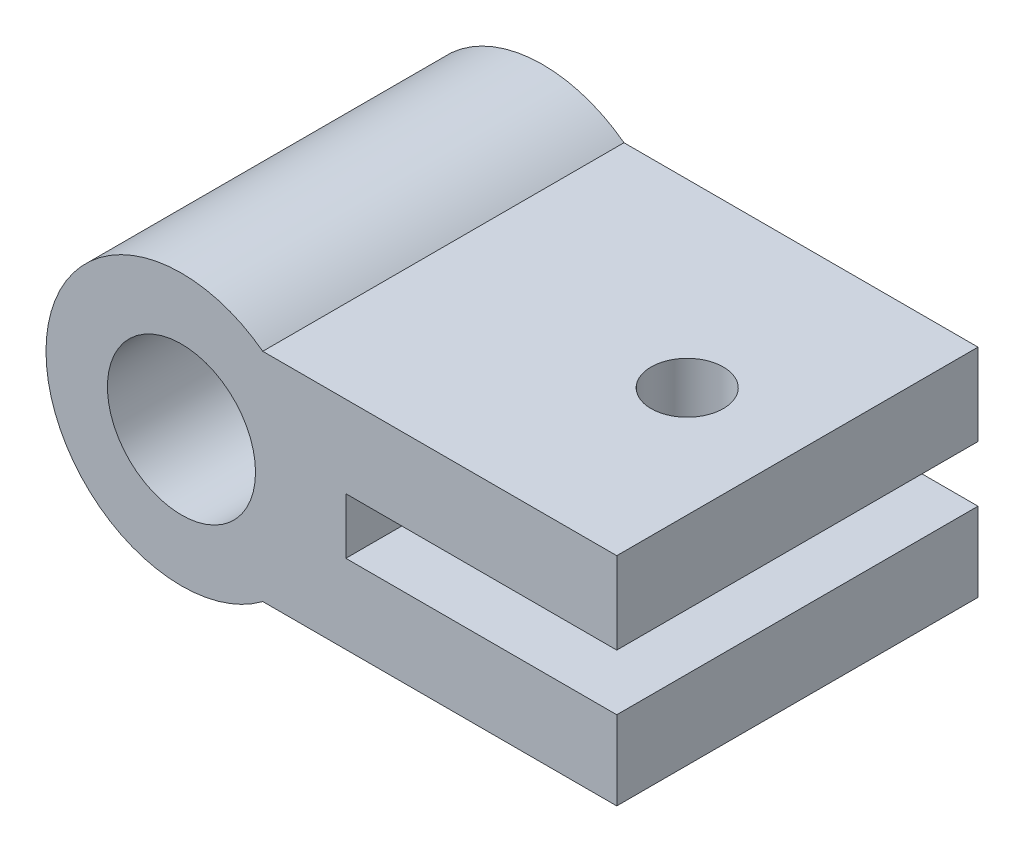
ISO-10303-21;
HEADER;
FILE_DESCRIPTION(('STEP AP214'),'2;1');
FILE_NAME('part.step','',(''),(''),'','','');
FILE_SCHEMA(('AUTOMOTIVE_DESIGN { 1 0 10303 214 1 1 1 1 }'));
ENDSEC;
DATA;
#1=APPLICATION_CONTEXT('core data for automotive mechanical design processes');
#2=APPLICATION_PROTOCOL_DEFINITION('international standard','automotive_design',2000,#1);
#3=PRODUCT_CONTEXT('',#1,'mechanical');
#4=PRODUCT('Part','Part','',(#3));
#5=PRODUCT_RELATED_PRODUCT_CATEGORY('part','',(#4));
#6=PRODUCT_DEFINITION_FORMATION('','',#4);
#7=PRODUCT_DEFINITION_CONTEXT('part definition',#1,'design');
#8=PRODUCT_DEFINITION('design','',#6,#7);
#9=PRODUCT_DEFINITION_SHAPE('','',#8);
#10=(LENGTH_UNIT() NAMED_UNIT(*) SI_UNIT(.MILLI.,.METRE.));
#11=(NAMED_UNIT(*) PLANE_ANGLE_UNIT() SI_UNIT($,.RADIAN.));
#12=(NAMED_UNIT(*) SI_UNIT($,.STERADIAN.) SOLID_ANGLE_UNIT());
#13=UNCERTAINTY_MEASURE_WITH_UNIT(LENGTH_MEASURE(1.E-05),#10,'distance_accuracy_value','');
#14=(GEOMETRIC_REPRESENTATION_CONTEXT(3) GLOBAL_UNCERTAINTY_ASSIGNED_CONTEXT((#13)) GLOBAL_UNIT_ASSIGNED_CONTEXT((#10,
#11,#12)) REPRESENTATION_CONTEXT('',''));
#15=CARTESIAN_POINT('',(0.,0.,0.));
#16=DIRECTION('',(0.,0.,1.));
#17=DIRECTION('',(1.,0.,0.));
#18=AXIS2_PLACEMENT_3D('',#15,#16,#17);
#19=CARTESIAN_POINT('',(24.1,-6.,0.));
#20=DIRECTION('',(1.,0.,0.));
#21=DIRECTION('',(0.,0.,-1.));
#22=AXIS2_PLACEMENT_3D('',#19,#20,#21);
#23=PLANE('',#22);
#24=DIRECTION('',(0.,0.,1.));
#25=VECTOR('',#24,1.);
#26=CARTESIAN_POINT('',(24.1,1.47289423943436,20.));
#27=LINE('',#26,#25);
#28=CARTESIAN_POINT('',(24.1,1.47289423943436,0.));
#29=VERTEX_POINT('',#28);
#30=CARTESIAN_POINT('',(24.1,1.47289423943436,20.));
#31=VERTEX_POINT('',#30);
#32=EDGE_CURVE('E125',#29,#31,#27,.T.);
#33=ORIENTED_EDGE('',*,*,#32,.F.);
#34=DIRECTION('',(0.,1.,0.));
#35=VECTOR('',#34,1.);
#36=CARTESIAN_POINT('',(24.1,-6.,0.));
#37=LINE('',#36,#35);
#38=CARTESIAN_POINT('',(24.1,6.,0.));
#39=VERTEX_POINT('',#38);
#40=EDGE_CURVE('E175',#29,#39,#37,.T.);
#41=ORIENTED_EDGE('',*,*,#40,.T.);
#42=DIRECTION('',(0.,0.,-1.));
#43=VECTOR('',#42,1.);
#44=CARTESIAN_POINT('',(24.1,6.,0.));
#45=LINE('',#44,#43);
#46=CARTESIAN_POINT('',(24.1,6.,20.));
#47=VERTEX_POINT('',#46);
#48=EDGE_CURVE('E149',#47,#39,#45,.T.);
#49=ORIENTED_EDGE('',*,*,#48,.F.);
#50=DIRECTION('',(0.,1.,0.));
#51=VECTOR('',#50,1.);
#52=CARTESIAN_POINT('',(24.1,-6.,20.));
#53=LINE('',#52,#51);
#54=EDGE_CURVE('E169',#31,#47,#53,.T.);
#55=ORIENTED_EDGE('',*,*,#54,.F.);
#56=EDGE_LOOP('',(#33,#41,#49,#55));
#57=FACE_BOUND('',#56,.T.);
#58=ADVANCED_FACE('F39',(#57),#23,.T.);
#59=CARTESIAN_POINT('',(18.,-6.,10.));
#60=DIRECTION('',(0.,1.,0.));
#61=DIRECTION('',(0.,0.,1.));
#62=AXIS2_PLACEMENT_3D('',#59,#60,#61);
#63=CYLINDRICAL_SURFACE('',#62,2.);
#64=CARTESIAN_POINT('',(18.,1.47289423943436,10.));
#65=DIRECTION('',(0.,1.,0.));
#66=DIRECTION('',(0.,0.,1.));
#67=AXIS2_PLACEMENT_3D('',#64,#65,#66);
#68=CIRCLE('',#67,2.);
#69=CARTESIAN_POINT('',(18.,1.47289423943436,12.));
#70=VERTEX_POINT('',#69);
#71=EDGE_CURVE('E43',#70,#70,#68,.F.);
#72=ORIENTED_EDGE('',*,*,#71,.T.);
#73=EDGE_LOOP('',(#72));
#74=FACE_BOUND('',#73,.T.);
#75=CARTESIAN_POINT('',(18.,6.,10.));
#76=DIRECTION('',(0.,1.,0.));
#77=DIRECTION('',(0.,0.,1.));
#78=AXIS2_PLACEMENT_3D('',#75,#76,#77);
#79=CIRCLE('',#78,2.);
#80=CARTESIAN_POINT('',(18.,6.,12.));
#81=VERTEX_POINT('',#80);
#82=EDGE_CURVE('E141',#81,#81,#79,.T.);
#83=ORIENTED_EDGE('',*,*,#82,.T.);
#84=EDGE_LOOP('',(#83));
#85=FACE_BOUND('',#84,.T.);
#86=ADVANCED_FACE('F231',(#74,#85),#63,.F.);
#87=CARTESIAN_POINT('',(0.,0.,20.));
#88=DIRECTION('',(0.,0.,-1.));
#89=DIRECTION('',(-1.,0.,0.));
#90=AXIS2_PLACEMENT_3D('',#87,#88,#89);
#91=CYLINDRICAL_SURFACE('',#90,7.5);
#92=DIRECTION('',(0.,0.,-1.));
#93=VECTOR('',#92,1.);
#94=CARTESIAN_POINT('',(4.5,-6.,20.));
#95=LINE('',#94,#93);
#96=CARTESIAN_POINT('',(4.5,-6.,20.));
#97=VERTEX_POINT('',#96);
#98=CARTESIAN_POINT('',(4.5,-6.,0.));
#99=VERTEX_POINT('',#98);
#100=EDGE_CURVE('E11',#97,#99,#95,.T.);
#101=ORIENTED_EDGE('',*,*,#100,.F.);
#102=CARTESIAN_POINT('',(0.,0.,20.));
#103=DIRECTION('',(0.,0.,1.));
#104=DIRECTION('',(1.,0.,0.));
#105=AXIS2_PLACEMENT_3D('',#102,#103,#104);
#106=CIRCLE('',#105,7.5);
#107=CARTESIAN_POINT('',(4.5,6.,20.));
#108=VERTEX_POINT('',#107);
#109=EDGE_CURVE('E186',#108,#97,#106,.T.);
#110=ORIENTED_EDGE('',*,*,#109,.F.);
#111=DIRECTION('',(0.,0.,-1.));
#112=VECTOR('',#111,1.);
#113=CARTESIAN_POINT('',(4.5,6.,20.));
#114=LINE('',#113,#112);
#115=CARTESIAN_POINT('',(4.5,6.,0.));
#116=VERTEX_POINT('',#115);
#117=EDGE_CURVE('E49',#108,#116,#114,.T.);
#118=ORIENTED_EDGE('',*,*,#117,.T.);
#119=CARTESIAN_POINT('',(0.,0.,0.));
#120=DIRECTION('',(0.,0.,1.));
#121=DIRECTION('',(1.,0.,0.));
#122=AXIS2_PLACEMENT_3D('',#119,#120,#121);
#123=CIRCLE('',#122,7.5);
#124=EDGE_CURVE('E182',#116,#99,#123,.T.);
#125=ORIENTED_EDGE('',*,*,#124,.T.);
#126=EDGE_LOOP('',(#101,#110,#118,#125));
#127=FACE_BOUND('',#126,.T.);
#128=ADVANCED_FACE('F41',(#127),#91,.T.);
#129=CARTESIAN_POINT('',(0.,0.,20.));
#130=DIRECTION('',(0.,0.,1.));
#131=DIRECTION('',(1.,0.,0.));
#132=AXIS2_PLACEMENT_3D('',#129,#130,#131);
#133=PLANE('',#132);
#134=DIRECTION('',(1.,0.,0.));
#135=VECTOR('',#134,1.);
#136=CARTESIAN_POINT('',(9.1,1.47289423943436,20.));
#137=LINE('',#136,#135);
#138=CARTESIAN_POINT('',(9.1,1.47289423943436,20.));
#139=VERTEX_POINT('',#138);
#140=EDGE_CURVE('E197',#139,#31,#137,.T.);
#141=ORIENTED_EDGE('',*,*,#140,.T.);
#142=ORIENTED_EDGE('',*,*,#54,.T.);
#143=DIRECTION('',(1.,0.,0.));
#144=VECTOR('',#143,1.);
#145=CARTESIAN_POINT('',(4.1,6.,20.));
#146=LINE('',#145,#144);
#147=EDGE_CURVE('E145',#108,#47,#146,.T.);
#148=ORIENTED_EDGE('',*,*,#147,.F.);
#149=ORIENTED_EDGE('',*,*,#109,.T.);
#150=DIRECTION('',(1.,0.,0.));
#151=VECTOR('',#150,1.);
#152=CARTESIAN_POINT('',(4.1,-6.,20.));
#153=LINE('',#152,#151);
#154=CARTESIAN_POINT('',(24.1,-6.,20.));
#155=VERTEX_POINT('',#154);
#156=EDGE_CURVE('E158',#97,#155,#153,.T.);
#157=ORIENTED_EDGE('',*,*,#156,.T.);
#158=CARTESIAN_POINT('',(24.1,-1.62710576056564,20.));
#159=VERTEX_POINT('',#158);
#160=EDGE_CURVE('E131',#155,#159,#53,.T.);
#161=ORIENTED_EDGE('',*,*,#160,.T.);
#162=DIRECTION('',(1.,0.,0.));
#163=VECTOR('',#162,1.);
#164=CARTESIAN_POINT('',(9.1,-1.62710576056564,20.));
#165=LINE('',#164,#163);
#166=CARTESIAN_POINT('',(9.1,-1.62710576056564,20.));
#167=VERTEX_POINT('',#166);
#168=EDGE_CURVE('E57',#167,#159,#165,.T.);
#169=ORIENTED_EDGE('',*,*,#168,.F.);
#170=DIRECTION('',(0.,-1.,0.));
#171=VECTOR('',#170,1.);
#172=CARTESIAN_POINT('',(9.1,1.47289423943436,20.));
#173=LINE('',#172,#171);
#174=EDGE_CURVE('E115',#139,#167,#173,.T.);
#175=ORIENTED_EDGE('',*,*,#174,.F.);
#176=EDGE_LOOP('',(#141,#142,#148,#149,#157,#161,#169,#175));
#177=FACE_BOUND('',#176,.T.);
#178=CARTESIAN_POINT('',(0.,0.,20.));
#179=DIRECTION('',(0.,0.,1.));
#180=DIRECTION('',(1.,0.,0.));
#181=AXIS2_PLACEMENT_3D('',#178,#179,#180);
#182=CIRCLE('',#181,4.1);
#183=CARTESIAN_POINT('',(4.1,0.,20.));
#184=VERTEX_POINT('',#183);
#185=EDGE_CURVE('E178',#184,#184,#182,.T.);
#186=ORIENTED_EDGE('',*,*,#185,.F.);
#187=EDGE_LOOP('',(#186));
#188=FACE_BOUND('',#187,.T.);
#189=ADVANCED_FACE('F128',(#177,#188),#133,.T.);
#190=CARTESIAN_POINT('',(0.,0.,0.));
#191=DIRECTION('',(0.,0.,1.));
#192=DIRECTION('',(1.,0.,0.));
#193=AXIS2_PLACEMENT_3D('',#190,#191,#192);
#194=PLANE('',#193);
#195=ORIENTED_EDGE('',*,*,#40,.F.);
#196=DIRECTION('',(1.,0.,0.));
#197=VECTOR('',#196,1.);
#198=CARTESIAN_POINT('',(9.1,1.47289423943436,0.));
#199=LINE('',#198,#197);
#200=CARTESIAN_POINT('',(9.1,1.47289423943436,0.));
#201=VERTEX_POINT('',#200);
#202=EDGE_CURVE('E136',#201,#29,#199,.T.);
#203=ORIENTED_EDGE('',*,*,#202,.F.);
#204=DIRECTION('',(0.,1.,0.));
#205=VECTOR('',#204,1.);
#206=CARTESIAN_POINT('',(9.1,1.47289423943436,0.));
#207=LINE('',#206,#205);
#208=CARTESIAN_POINT('',(9.1,-1.62710576056564,0.));
#209=VERTEX_POINT('',#208);
#210=EDGE_CURVE('E114',#209,#201,#207,.T.);
#211=ORIENTED_EDGE('',*,*,#210,.F.);
#212=DIRECTION('',(1.,0.,0.));
#213=VECTOR('',#212,1.);
#214=CARTESIAN_POINT('',(9.1,-1.62710576056564,0.));
#215=LINE('',#214,#213);
#216=CARTESIAN_POINT('',(24.1,-1.62710576056564,0.));
#217=VERTEX_POINT('',#216);
#218=EDGE_CURVE('E110',#209,#217,#215,.T.);
#219=ORIENTED_EDGE('',*,*,#218,.T.);
#220=CARTESIAN_POINT('',(24.1,-6.,0.));
#221=VERTEX_POINT('',#220);
#222=EDGE_CURVE('E170',#221,#217,#37,.T.);
#223=ORIENTED_EDGE('',*,*,#222,.F.);
#224=DIRECTION('',(-1.,0.,0.));
#225=VECTOR('',#224,1.);
#226=CARTESIAN_POINT('',(4.1,-6.,0.));
#227=LINE('',#226,#225);
#228=EDGE_CURVE('E165',#221,#99,#227,.T.);
#229=ORIENTED_EDGE('',*,*,#228,.T.);
#230=ORIENTED_EDGE('',*,*,#124,.F.);
#231=DIRECTION('',(-1.,0.,0.));
#232=VECTOR('',#231,1.);
#233=CARTESIAN_POINT('',(4.1,6.,0.));
#234=LINE('',#233,#232);
#235=EDGE_CURVE('E65',#39,#116,#234,.T.);
#236=ORIENTED_EDGE('',*,*,#235,.F.);
#237=EDGE_LOOP('',(#195,#203,#211,#219,#223,#229,#230,#236));
#238=FACE_BOUND('',#237,.T.);
#239=CARTESIAN_POINT('',(0.,0.,0.));
#240=DIRECTION('',(0.,0.,1.));
#241=DIRECTION('',(1.,0.,0.));
#242=AXIS2_PLACEMENT_3D('',#239,#240,#241);
#243=CIRCLE('',#242,4.1);
#244=CARTESIAN_POINT('',(4.1,0.,0.));
#245=VERTEX_POINT('',#244);
#246=EDGE_CURVE('E174',#245,#245,#243,.T.);
#247=ORIENTED_EDGE('',*,*,#246,.T.);
#248=EDGE_LOOP('',(#247));
#249=FACE_BOUND('',#248,.T.);
#250=ADVANCED_FACE('F220',(#238,#249),#194,.F.);
#251=CARTESIAN_POINT('',(0.,0.,20.));
#252=DIRECTION('',(0.,0.,-1.));
#253=DIRECTION('',(-1.,0.,0.));
#254=AXIS2_PLACEMENT_3D('',#251,#252,#253);
#255=CYLINDRICAL_SURFACE('',#254,4.1);
#256=ORIENTED_EDGE('',*,*,#246,.F.);
#257=EDGE_LOOP('',(#256));
#258=FACE_BOUND('',#257,.T.);
#259=ORIENTED_EDGE('',*,*,#185,.T.);
#260=EDGE_LOOP('',(#259));
#261=FACE_BOUND('',#260,.T.);
#262=ADVANCED_FACE('F266',(#258,#261),#255,.F.);
#263=CARTESIAN_POINT('',(0.,-6.,0.));
#264=DIRECTION('',(0.,1.,0.));
#265=DIRECTION('',(0.,0.,1.));
#266=AXIS2_PLACEMENT_3D('',#263,#264,#265);
#267=PLANE('',#266);
#268=CARTESIAN_POINT('',(18.,-6.,10.));
#269=DIRECTION('',(0.,1.,0.));
#270=DIRECTION('',(0.,0.,1.));
#271=AXIS2_PLACEMENT_3D('',#268,#269,#270);
#272=CIRCLE('',#271,2.);
#273=CARTESIAN_POINT('',(18.,-6.,12.));
#274=VERTEX_POINT('',#273);
#275=EDGE_CURVE('E154',#274,#274,#272,.T.);
#276=ORIENTED_EDGE('',*,*,#275,.T.);
#277=EDGE_LOOP('',(#276));
#278=FACE_BOUND('',#277,.T.);
#279=ORIENTED_EDGE('',*,*,#156,.F.);
#280=ORIENTED_EDGE('',*,*,#100,.T.);
#281=ORIENTED_EDGE('',*,*,#228,.F.);
#282=DIRECTION('',(0.,0.,-1.));
#283=VECTOR('',#282,1.);
#284=CARTESIAN_POINT('',(24.1,-6.,0.));
#285=LINE('',#284,#283);
#286=EDGE_CURVE('E161',#155,#221,#285,.T.);
#287=ORIENTED_EDGE('',*,*,#286,.F.);
#288=EDGE_LOOP('',(#279,#280,#281,#287));
#289=FACE_BOUND('',#288,.T.);
#290=ADVANCED_FACE('F249',(#278,#289),#267,.F.);
#291=CARTESIAN_POINT('',(0.,6.,0.));
#292=DIRECTION('',(0.,1.,0.));
#293=DIRECTION('',(0.,0.,1.));
#294=AXIS2_PLACEMENT_3D('',#291,#292,#293);
#295=PLANE('',#294);
#296=ORIENTED_EDGE('',*,*,#82,.F.);
#297=EDGE_LOOP('',(#296));
#298=FACE_BOUND('',#297,.T.);
#299=ORIENTED_EDGE('',*,*,#117,.F.);
#300=ORIENTED_EDGE('',*,*,#147,.T.);
#301=ORIENTED_EDGE('',*,*,#48,.T.);
#302=ORIENTED_EDGE('',*,*,#235,.T.);
#303=EDGE_LOOP('',(#299,#300,#301,#302));
#304=FACE_BOUND('',#303,.T.);
#305=ADVANCED_FACE('F229',(#298,#304),#295,.T.);
#306=DIRECTION('',(0.,0.,-1.));
#307=VECTOR('',#306,1.);
#308=CARTESIAN_POINT('',(24.1,-1.62710576056564,20.));
#309=LINE('',#308,#307);
#310=EDGE_CURVE('E209',#159,#217,#309,.T.);
#311=ORIENTED_EDGE('',*,*,#310,.F.);
#312=ORIENTED_EDGE('',*,*,#160,.F.);
#313=ORIENTED_EDGE('',*,*,#286,.T.);
#314=ORIENTED_EDGE('',*,*,#222,.T.);
#315=EDGE_LOOP('',(#311,#312,#313,#314));
#316=FACE_BOUND('',#315,.T.);
#317=ADVANCED_FACE('F233',(#316),#23,.T.);
#318=CARTESIAN_POINT('',(18.,-1.62710576056564,10.));
#319=DIRECTION('',(0.,-1.,0.));
#320=DIRECTION('',(0.,0.,-1.));
#321=AXIS2_PLACEMENT_3D('',#318,#319,#320);
#322=CIRCLE('',#321,2.);
#323=CARTESIAN_POINT('',(18.,-1.62710576056564,8.));
#324=VERTEX_POINT('',#323);
#325=EDGE_CURVE('E194',#324,#324,#322,.F.);
#326=ORIENTED_EDGE('',*,*,#325,.T.);
#327=EDGE_LOOP('',(#326));
#328=FACE_BOUND('',#327,.T.);
#329=ORIENTED_EDGE('',*,*,#275,.F.);
#330=EDGE_LOOP('',(#329));
#331=FACE_BOUND('',#330,.T.);
#332=ADVANCED_FACE('F240',(#328,#331),#63,.F.);
#333=CARTESIAN_POINT('',(9.1,1.47289423943436,20.));
#334=DIRECTION('',(0.,1.,0.));
#335=DIRECTION('',(0.,0.,1.));
#336=AXIS2_PLACEMENT_3D('',#333,#334,#335);
#337=PLANE('',#336);
#338=ORIENTED_EDGE('',*,*,#32,.T.);
#339=ORIENTED_EDGE('',*,*,#140,.F.);
#340=DIRECTION('',(0.,0.,1.));
#341=VECTOR('',#340,1.);
#342=CARTESIAN_POINT('',(9.1,1.47289423943436,20.));
#343=LINE('',#342,#341);
#344=EDGE_CURVE('E121',#201,#139,#343,.T.);
#345=ORIENTED_EDGE('',*,*,#344,.F.);
#346=ORIENTED_EDGE('',*,*,#202,.T.);
#347=EDGE_LOOP('',(#338,#339,#345,#346));
#348=FACE_BOUND('',#347,.T.);
#349=ORIENTED_EDGE('',*,*,#71,.F.);
#350=EDGE_LOOP('',(#349));
#351=FACE_BOUND('',#350,.T.);
#352=ADVANCED_FACE('F216',(#348,#351),#337,.F.);
#353=CARTESIAN_POINT('',(9.1,-1.62710576056564,20.));
#354=DIRECTION('',(0.,-1.,0.));
#355=DIRECTION('',(0.,0.,-1.));
#356=AXIS2_PLACEMENT_3D('',#353,#354,#355);
#357=PLANE('',#356);
#358=ORIENTED_EDGE('',*,*,#310,.T.);
#359=ORIENTED_EDGE('',*,*,#218,.F.);
#360=DIRECTION('',(0.,0.,-1.));
#361=VECTOR('',#360,1.);
#362=CARTESIAN_POINT('',(9.1,-1.62710576056564,20.));
#363=LINE('',#362,#361);
#364=EDGE_CURVE('E105',#167,#209,#363,.T.);
#365=ORIENTED_EDGE('',*,*,#364,.F.);
#366=ORIENTED_EDGE('',*,*,#168,.T.);
#367=EDGE_LOOP('',(#358,#359,#365,#366));
#368=FACE_BOUND('',#367,.T.);
#369=ORIENTED_EDGE('',*,*,#325,.F.);
#370=EDGE_LOOP('',(#369));
#371=FACE_BOUND('',#370,.T.);
#372=ADVANCED_FACE('F107',(#368,#371),#357,.F.);
#373=CARTESIAN_POINT('',(9.1,0.,0.));
#374=DIRECTION('',(1.,0.,0.));
#375=DIRECTION('',(0.,0.,-1.));
#376=AXIS2_PLACEMENT_3D('',#373,#374,#375);
#377=PLANE('',#376);
#378=ORIENTED_EDGE('',*,*,#174,.T.);
#379=ORIENTED_EDGE('',*,*,#364,.T.);
#380=ORIENTED_EDGE('',*,*,#210,.T.);
#381=ORIENTED_EDGE('',*,*,#344,.T.);
#382=EDGE_LOOP('',(#378,#379,#380,#381));
#383=FACE_BOUND('',#382,.T.);
#384=ADVANCED_FACE('F119',(#383),#377,.T.);
#385=CLOSED_SHELL('',(#58,#86,#128,#189,#250,#262,#290,#305,#317,#332,#352,#372,#384));
#386=MANIFOLD_SOLID_BREP('B2',#385);
#387=ADVANCED_BREP_SHAPE_REPRESENTATION('',(#18,#386),#14);
#388=SHAPE_DEFINITION_REPRESENTATION(#9,#387);
ENDSEC;
END-ISO-10303-21;
